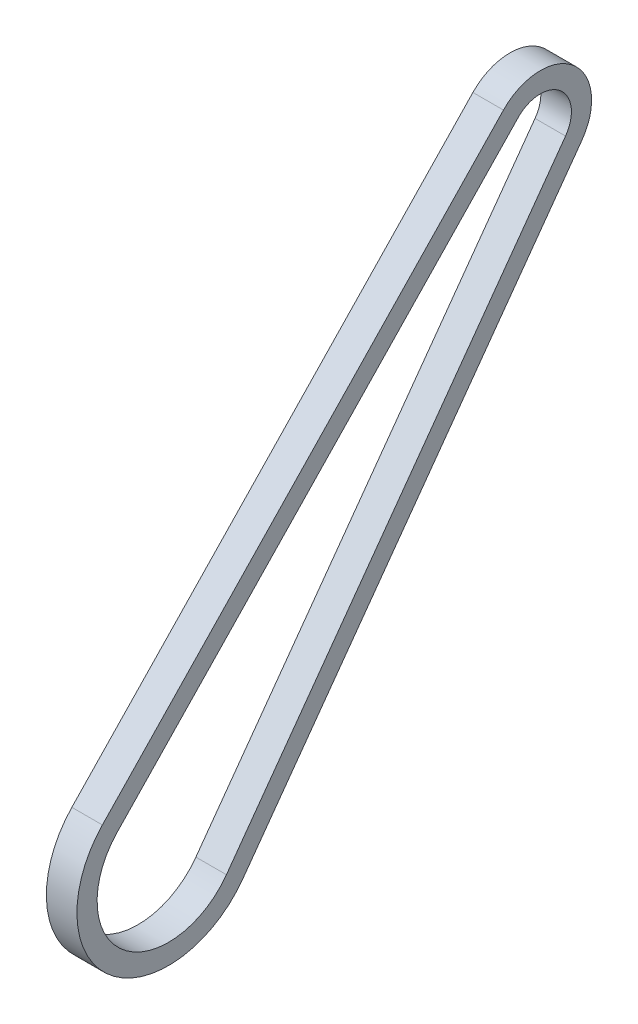
ISO-10303-21;
HEADER;
FILE_DESCRIPTION(('STEP AP214'),'2;1');
FILE_NAME('part.step','',(''),(''),'','','');
FILE_SCHEMA(('AUTOMOTIVE_DESIGN { 1 0 10303 214 1 1 1 1 }'));
ENDSEC;
DATA;
#1=APPLICATION_CONTEXT('core data for automotive mechanical design processes');
#2=APPLICATION_PROTOCOL_DEFINITION('international standard','automotive_design',2000,#1);
#3=PRODUCT_CONTEXT('',#1,'mechanical');
#4=PRODUCT('Part','Part','',(#3));
#5=PRODUCT_RELATED_PRODUCT_CATEGORY('part','',(#4));
#6=PRODUCT_DEFINITION_FORMATION('','',#4);
#7=PRODUCT_DEFINITION_CONTEXT('part definition',#1,'design');
#8=PRODUCT_DEFINITION('design','',#6,#7);
#9=PRODUCT_DEFINITION_SHAPE('','',#8);
#10=(LENGTH_UNIT() NAMED_UNIT(*) SI_UNIT(.MILLI.,.METRE.));
#11=(NAMED_UNIT(*) PLANE_ANGLE_UNIT() SI_UNIT($,.RADIAN.));
#12=(NAMED_UNIT(*) SI_UNIT($,.STERADIAN.) SOLID_ANGLE_UNIT());
#13=UNCERTAINTY_MEASURE_WITH_UNIT(LENGTH_MEASURE(1.E-05),#10,'distance_accuracy_value','');
#14=(GEOMETRIC_REPRESENTATION_CONTEXT(3) GLOBAL_UNCERTAINTY_ASSIGNED_CONTEXT((#13)) GLOBAL_UNIT_ASSIGNED_CONTEXT((#10,
#11,#12)) REPRESENTATION_CONTEXT('',''));
#15=CARTESIAN_POINT('',(0.,0.,0.));
#16=DIRECTION('',(0.,0.,1.));
#17=DIRECTION('',(1.,0.,0.));
#18=AXIS2_PLACEMENT_3D('',#15,#16,#17);
#19=CARTESIAN_POINT('',(4.5593,-178.949423608591,95.885));
#20=DIRECTION('',(-1.,0.,0.));
#21=DIRECTION('',(0.,0.,1.));
#22=AXIS2_PLACEMENT_3D('',#19,#20,#21);
#23=CYLINDRICAL_SURFACE('',#22,9.25735799387115);
#24=CARTESIAN_POINT('',(-4.5593,-178.949423608591,95.885));
#25=DIRECTION('',(1.,0.,0.));
#26=DIRECTION('',(0.,0.,-1.));
#27=AXIS2_PLACEMENT_3D('',#24,#25,#26);
#28=CIRCLE('',#27,9.25735799387115);
#29=CARTESIAN_POINT('',(-4.5593,-184.365091642612,88.3770564218979));
#30=VERTEX_POINT('',#29);
#31=CARTESIAN_POINT('',(-4.5593,-172.544778372609,102.569249877728));
#32=VERTEX_POINT('',#31);
#33=EDGE_CURVE('E137',#30,#32,#28,.T.);
#34=ORIENTED_EDGE('',*,*,#33,.F.);
#35=DIRECTION('',(-1.,0.,0.));
#36=VECTOR('',#35,1.);
#37=CARTESIAN_POINT('',(4.5593,-184.365091642612,88.3770564218979));
#38=LINE('',#37,#36);
#39=CARTESIAN_POINT('',(4.5593,-184.365091642612,88.3770564218979));
#40=VERTEX_POINT('',#39);
#41=EDGE_CURVE('E11',#40,#30,#38,.T.);
#42=ORIENTED_EDGE('',*,*,#41,.F.);
#43=CARTESIAN_POINT('',(4.5593,-178.949423608591,95.885));
#44=DIRECTION('',(1.,0.,0.));
#45=DIRECTION('',(0.,0.,-1.));
#46=AXIS2_PLACEMENT_3D('',#43,#44,#45);
#47=CIRCLE('',#46,9.25735799387115);
#48=CARTESIAN_POINT('',(4.5593,-172.544778372609,102.569249877728));
#49=VERTEX_POINT('',#48);
#50=EDGE_CURVE('E97',#40,#49,#47,.T.);
#51=ORIENTED_EDGE('',*,*,#50,.T.);
#52=DIRECTION('',(-1.,0.,0.));
#53=VECTOR('',#52,1.);
#54=CARTESIAN_POINT('',(4.5593,-172.544778372609,102.569249877728));
#55=LINE('',#54,#53);
#56=EDGE_CURVE('E71',#49,#32,#55,.T.);
#57=ORIENTED_EDGE('',*,*,#56,.T.);
#58=EDGE_LOOP('',(#34,#42,#51,#57));
#59=FACE_BOUND('',#58,.T.);
#60=ADVANCED_FACE('F17',(#59),#23,.F.);
#61=CARTESIAN_POINT('',(4.5593,-254.529922250949,138.98870877187));
#62=DIRECTION('',(0.,-0.585012272141483,-0.811024439486172));
#63=DIRECTION('',(0.,0.811024439486172,-0.585012272141483));
#64=AXIS2_PLACEMENT_3D('',#61,#62,#63);
#65=PLANE('',#64);
#66=DIRECTION('',(0.,-0.811024439486172,0.585012272141483));
#67=VECTOR('',#66,1.);
#68=CARTESIAN_POINT('',(-4.5593,-254.529922250949,138.98870877187));
#69=LINE('',#68,#67);
#70=CARTESIAN_POINT('',(-4.5593,-324.694752859285,189.600361121842));
#71=VERTEX_POINT('',#70);
#72=EDGE_CURVE('E104',#30,#71,#69,.T.);
#73=ORIENTED_EDGE('',*,*,#72,.T.);
#74=DIRECTION('',(-1.,0.,0.));
#75=VECTOR('',#74,1.);
#76=CARTESIAN_POINT('',(4.5593,-324.694752859285,189.600361121842));
#77=LINE('',#76,#75);
#78=CARTESIAN_POINT('',(4.5593,-324.694752859285,189.600361121842));
#79=VERTEX_POINT('',#78);
#80=EDGE_CURVE('E28',#79,#71,#77,.T.);
#81=ORIENTED_EDGE('',*,*,#80,.F.);
#82=DIRECTION('',(0.,-0.811024439486172,0.585012272141483));
#83=VECTOR('',#82,1.);
#84=CARTESIAN_POINT('',(4.5593,-254.529922250949,138.98870877187));
#85=LINE('',#84,#83);
#86=EDGE_CURVE('E92',#40,#79,#85,.T.);
#87=ORIENTED_EDGE('',*,*,#86,.F.);
#88=ORIENTED_EDGE('',*,*,#41,.T.);
#89=EDGE_LOOP('',(#73,#81,#87,#88));
#90=FACE_BOUND('',#89,.T.);
#91=ADVANCED_FACE('F102',(#90),#65,.F.);
#92=CARTESIAN_POINT('',(4.5593,-312.225380197659,206.88711980234));
#93=DIRECTION('',(-1.,0.,0.));
#94=DIRECTION('',(0.,0.,1.));
#95=AXIS2_PLACEMENT_3D('',#92,#93,#94);
#96=CYLINDRICAL_SURFACE('',#95,21.3147198023407);
#97=CARTESIAN_POINT('',(-4.5593,-312.225380197659,206.88711980234));
#98=DIRECTION('',(1.,0.,0.));
#99=DIRECTION('',(0.,0.,-1.));
#100=AXIS2_PLACEMENT_3D('',#97,#98,#99);
#101=CIRCLE('',#100,21.3147198023407);
#102=CARTESIAN_POINT('',(-4.5593,-297.47892459675,222.277354610904));
#103=VERTEX_POINT('',#102);
#104=EDGE_CURVE('E143',#103,#71,#101,.T.);
#105=ORIENTED_EDGE('',*,*,#104,.F.);
#106=DIRECTION('',(-1.,0.,0.));
#107=VECTOR('',#106,1.);
#108=CARTESIAN_POINT('',(4.5593,-297.47892459675,222.277354610904));
#109=LINE('',#108,#107);
#110=CARTESIAN_POINT('',(4.5593,-297.47892459675,222.277354610904));
#111=VERTEX_POINT('',#110);
#112=EDGE_CURVE('E64',#111,#103,#109,.T.);
#113=ORIENTED_EDGE('',*,*,#112,.F.);
#114=CARTESIAN_POINT('',(4.5593,-312.225380197659,206.88711980234));
#115=DIRECTION('',(1.,0.,0.));
#116=DIRECTION('',(0.,0.,-1.));
#117=AXIS2_PLACEMENT_3D('',#114,#115,#116);
#118=CIRCLE('',#117,21.3147198023407);
#119=EDGE_CURVE('E96',#111,#79,#118,.T.);
#120=ORIENTED_EDGE('',*,*,#119,.T.);
#121=ORIENTED_EDGE('',*,*,#80,.T.);
#122=EDGE_LOOP('',(#105,#113,#120,#121));
#123=FACE_BOUND('',#122,.T.);
#124=ADVANCED_FACE('F110',(#123),#96,.F.);
#125=CARTESIAN_POINT('',(4.5593,-258.051579126787,134.106503851051));
#126=DIRECTION('',(0.,-0.585012272141483,-0.811024439486172));
#127=DIRECTION('',(0.,0.811024439486172,-0.585012272141483));
#128=AXIS2_PLACEMENT_3D('',#125,#126,#127);
#129=PLANE('',#128);
#130=DIRECTION('',(0.,-0.811024439486172,0.585012272141483));
#131=VECTOR('',#130,1.);
#132=CARTESIAN_POINT('',(-4.5593,-258.051579126787,134.106503851051));
#133=LINE('',#132,#131);
#134=CARTESIAN_POINT('',(-4.5593,-187.88674851845,83.494851501079));
#135=VERTEX_POINT('',#134);
#136=CARTESIAN_POINT('',(-4.5593,-328.216409735123,184.718156201024));
#137=VERTEX_POINT('',#136);
#138=EDGE_CURVE('E121',#135,#137,#133,.T.);
#139=ORIENTED_EDGE('',*,*,#138,.F.);
#140=DIRECTION('',(-1.,0.,0.));
#141=VECTOR('',#140,1.);
#142=CARTESIAN_POINT('',(4.5593,-187.88674851845,83.494851501079));
#143=LINE('',#142,#141);
#144=CARTESIAN_POINT('',(4.5593,-187.88674851845,83.494851501079));
#145=VERTEX_POINT('',#144);
#146=EDGE_CURVE('E21',#145,#135,#143,.T.);
#147=ORIENTED_EDGE('',*,*,#146,.F.);
#148=DIRECTION('',(0.,-0.811024439486172,0.585012272141483));
#149=VECTOR('',#148,1.);
#150=CARTESIAN_POINT('',(4.5593,-258.051579126787,134.106503851051));
#151=LINE('',#150,#149);
#152=CARTESIAN_POINT('',(4.5593,-328.216409735123,184.718156201024));
#153=VERTEX_POINT('',#152);
#154=EDGE_CURVE('E149',#145,#153,#151,.T.);
#155=ORIENTED_EDGE('',*,*,#154,.T.);
#156=DIRECTION('',(-1.,0.,0.));
#157=VECTOR('',#156,1.);
#158=CARTESIAN_POINT('',(4.5593,-328.216409735123,184.718156201024));
#159=LINE('',#158,#157);
#160=EDGE_CURVE('E117',#153,#137,#159,.T.);
#161=ORIENTED_EDGE('',*,*,#160,.T.);
#162=EDGE_LOOP('',(#139,#147,#155,#161));
#163=FACE_BOUND('',#162,.T.);
#164=ADVANCED_FACE('F19',(#163),#129,.T.);
#165=CARTESIAN_POINT('',(4.5593,-178.949423608591,95.885));
#166=DIRECTION('',(-1.,0.,0.));
#167=DIRECTION('',(0.,0.,1.));
#168=AXIS2_PLACEMENT_3D('',#165,#166,#167);
#169=CYLINDRICAL_SURFACE('',#168,15.2771579938711);
#170=CARTESIAN_POINT('',(-4.5593,-178.949423608591,95.885));
#171=DIRECTION('',(1.,0.,0.));
#172=DIRECTION('',(0.,0.,-1.));
#173=AXIS2_PLACEMENT_3D('',#170,#171,#172);
#174=CIRCLE('',#173,15.2771579938711);
#175=CARTESIAN_POINT('',(-4.5593,-168.380017388203,106.91582991067));
#176=VERTEX_POINT('',#175);
#177=EDGE_CURVE('E125',#135,#176,#174,.T.);
#178=ORIENTED_EDGE('',*,*,#177,.T.);
#179=DIRECTION('',(-1.,0.,0.));
#180=VECTOR('',#179,1.);
#181=CARTESIAN_POINT('',(4.5593,-168.380017388203,106.91582991067));
#182=LINE('',#181,#180);
#183=CARTESIAN_POINT('',(4.5593,-168.380017388203,106.91582991067));
#184=VERTEX_POINT('',#183);
#185=EDGE_CURVE('E158',#184,#176,#182,.T.);
#186=ORIENTED_EDGE('',*,*,#185,.F.);
#187=CARTESIAN_POINT('',(4.5593,-178.949423608591,95.885));
#188=DIRECTION('',(1.,0.,0.));
#189=DIRECTION('',(0.,0.,-1.));
#190=AXIS2_PLACEMENT_3D('',#187,#188,#189);
#191=CIRCLE('',#190,15.2771579938711);
#192=EDGE_CURVE('E167',#145,#184,#191,.T.);
#193=ORIENTED_EDGE('',*,*,#192,.F.);
#194=ORIENTED_EDGE('',*,*,#146,.T.);
#195=EDGE_LOOP('',(#178,#186,#193,#194));
#196=FACE_BOUND('',#195,.T.);
#197=ADVANCED_FACE('F166',(#196),#169,.T.);
#198=CARTESIAN_POINT('',(4.5593,-230.847090500273,166.769882277257));
#199=DIRECTION('',(0.,0.691843746371424,0.722047249566642));
#200=DIRECTION('',(0.,-0.722047249566642,0.691843746371424));
#201=AXIS2_PLACEMENT_3D('',#198,#199,#200);
#202=PLANE('',#201);
#203=DIRECTION('',(0.,0.722047249566642,-0.691843746371424));
#204=VECTOR('',#203,1.);
#205=CARTESIAN_POINT('',(-4.5593,-230.847090500273,166.769882277257));
#206=LINE('',#205,#204);
#207=CARTESIAN_POINT('',(-4.5593,-293.314163612344,226.623934643846));
#208=VERTEX_POINT('',#207);
#209=EDGE_CURVE('E129',#208,#176,#206,.T.);
#210=ORIENTED_EDGE('',*,*,#209,.F.);
#211=DIRECTION('',(-1.,0.,0.));
#212=VECTOR('',#211,1.);
#213=CARTESIAN_POINT('',(4.5593,-293.314163612344,226.623934643846));
#214=LINE('',#213,#212);
#215=CARTESIAN_POINT('',(4.5593,-293.314163612344,226.623934643846));
#216=VERTEX_POINT('',#215);
#217=EDGE_CURVE('E156',#216,#208,#214,.T.);
#218=ORIENTED_EDGE('',*,*,#217,.F.);
#219=DIRECTION('',(0.,0.722047249566642,-0.691843746371424));
#220=VECTOR('',#219,1.);
#221=CARTESIAN_POINT('',(4.5593,-230.847090500273,166.769882277257));
#222=LINE('',#221,#220);
#223=EDGE_CURVE('E179',#216,#184,#222,.T.);
#224=ORIENTED_EDGE('',*,*,#223,.T.);
#225=ORIENTED_EDGE('',*,*,#185,.T.);
#226=EDGE_LOOP('',(#210,#218,#224,#225));
#227=FACE_BOUND('',#226,.T.);
#228=ADVANCED_FACE('F177',(#227),#202,.T.);
#229=CARTESIAN_POINT('',(4.5593,-312.225380197659,206.88711980234));
#230=DIRECTION('',(-1.,0.,0.));
#231=DIRECTION('',(0.,0.,1.));
#232=AXIS2_PLACEMENT_3D('',#229,#230,#231);
#233=CYLINDRICAL_SURFACE('',#232,27.3345198023408);
#234=CARTESIAN_POINT('',(-4.5593,-312.225380197659,206.88711980234));
#235=DIRECTION('',(1.,0.,0.));
#236=DIRECTION('',(0.,0.,-1.));
#237=AXIS2_PLACEMENT_3D('',#234,#235,#236);
#238=CIRCLE('',#237,27.3345198023408);
#239=EDGE_CURVE('E133',#208,#137,#238,.T.);
#240=ORIENTED_EDGE('',*,*,#239,.T.);
#241=ORIENTED_EDGE('',*,*,#160,.F.);
#242=CARTESIAN_POINT('',(4.5593,-312.225380197659,206.88711980234));
#243=DIRECTION('',(1.,0.,0.));
#244=DIRECTION('',(0.,0.,-1.));
#245=AXIS2_PLACEMENT_3D('',#242,#243,#244);
#246=CIRCLE('',#245,27.3345198023408);
#247=EDGE_CURVE('E180',#216,#153,#246,.T.);
#248=ORIENTED_EDGE('',*,*,#247,.F.);
#249=ORIENTED_EDGE('',*,*,#217,.T.);
#250=EDGE_LOOP('',(#240,#241,#248,#249));
#251=FACE_BOUND('',#250,.T.);
#252=ADVANCED_FACE('F176',(#251),#233,.T.);
#253=CARTESIAN_POINT('',(4.5593,-235.01185148468,162.423302244317));
#254=DIRECTION('',(0.,0.691843746371424,0.722047249566642));
#255=DIRECTION('',(0.,-0.722047249566642,0.691843746371424));
#256=AXIS2_PLACEMENT_3D('',#253,#254,#255);
#257=PLANE('',#256);
#258=DIRECTION('',(0.,0.722047249566642,-0.691843746371424));
#259=VECTOR('',#258,1.);
#260=CARTESIAN_POINT('',(-4.5593,-235.01185148468,162.423302244317));
#261=LINE('',#260,#259);
#262=EDGE_CURVE('E146',#103,#32,#261,.T.);
#263=ORIENTED_EDGE('',*,*,#262,.T.);
#264=ORIENTED_EDGE('',*,*,#56,.F.);
#265=DIRECTION('',(0.,0.722047249566642,-0.691843746371424));
#266=VECTOR('',#265,1.);
#267=CARTESIAN_POINT('',(4.5593,-235.01185148468,162.423302244317));
#268=LINE('',#267,#266);
#269=EDGE_CURVE('E37',#111,#49,#268,.T.);
#270=ORIENTED_EDGE('',*,*,#269,.F.);
#271=ORIENTED_EDGE('',*,*,#112,.T.);
#272=EDGE_LOOP('',(#263,#264,#270,#271));
#273=FACE_BOUND('',#272,.T.);
#274=ADVANCED_FACE('F189',(#273),#257,.F.);
#275=CARTESIAN_POINT('',(4.5593,-251.61608280736,157.414740805405));
#276=DIRECTION('',(1.,0.,0.));
#277=DIRECTION('',(0.,1.,0.));
#278=AXIS2_PLACEMENT_3D('',#275,#276,#277);
#279=PLANE('',#278);
#280=ORIENTED_EDGE('',*,*,#154,.F.);
#281=ORIENTED_EDGE('',*,*,#192,.T.);
#282=ORIENTED_EDGE('',*,*,#223,.F.);
#283=ORIENTED_EDGE('',*,*,#247,.T.);
#284=EDGE_LOOP('',(#280,#281,#282,#283));
#285=FACE_BOUND('',#284,.T.);
#286=ORIENTED_EDGE('',*,*,#50,.F.);
#287=ORIENTED_EDGE('',*,*,#86,.T.);
#288=ORIENTED_EDGE('',*,*,#119,.F.);
#289=ORIENTED_EDGE('',*,*,#269,.T.);
#290=EDGE_LOOP('',(#286,#287,#288,#289));
#291=FACE_BOUND('',#290,.T.);
#292=ADVANCED_FACE('F94',(#285,#291),#279,.T.);
#293=CARTESIAN_POINT('',(-4.5593,-251.61608280736,157.414740805405));
#294=DIRECTION('',(1.,0.,0.));
#295=DIRECTION('',(0.,1.,0.));
#296=AXIS2_PLACEMENT_3D('',#293,#294,#295);
#297=PLANE('',#296);
#298=ORIENTED_EDGE('',*,*,#138,.T.);
#299=ORIENTED_EDGE('',*,*,#239,.F.);
#300=ORIENTED_EDGE('',*,*,#209,.T.);
#301=ORIENTED_EDGE('',*,*,#177,.F.);
#302=EDGE_LOOP('',(#298,#299,#300,#301));
#303=FACE_BOUND('',#302,.T.);
#304=ORIENTED_EDGE('',*,*,#33,.T.);
#305=ORIENTED_EDGE('',*,*,#262,.F.);
#306=ORIENTED_EDGE('',*,*,#104,.T.);
#307=ORIENTED_EDGE('',*,*,#72,.F.);
#308=EDGE_LOOP('',(#304,#305,#306,#307));
#309=FACE_BOUND('',#308,.T.);
#310=ADVANCED_FACE('F170',(#303,#309),#297,.F.);
#311=CLOSED_SHELL('',(#60,#91,#124,#164,#197,#228,#252,#274,#292,#310));
#312=MANIFOLD_SOLID_BREP('B1',#311);
#313=ADVANCED_BREP_SHAPE_REPRESENTATION('',(#18,#312),#14);
#314=SHAPE_DEFINITION_REPRESENTATION(#9,#313);
ENDSEC;
END-ISO-10303-21;
